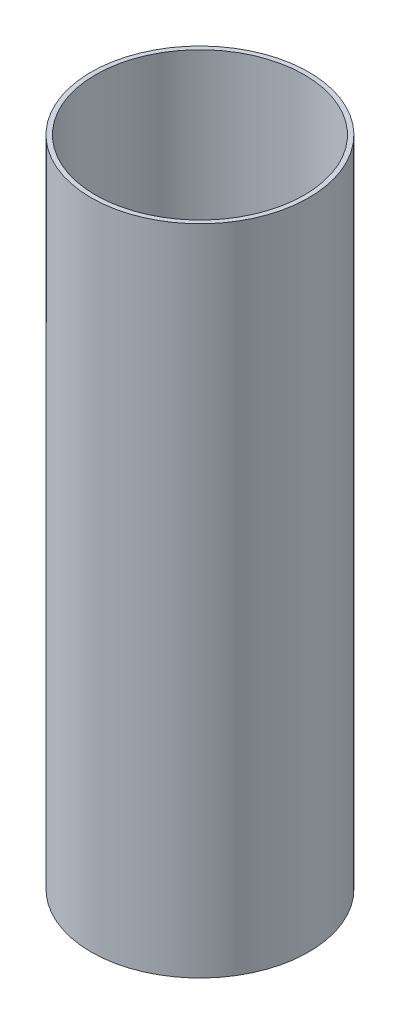
ISO-10303-21;
HEADER;
FILE_DESCRIPTION(('STEP AP214'),'2;1');
FILE_NAME('part.step','',(''),(''),'','','');
FILE_SCHEMA(('AUTOMOTIVE_DESIGN { 1 0 10303 214 1 1 1 1 }'));
ENDSEC;
DATA;
#1=APPLICATION_CONTEXT('core data for automotive mechanical design processes');
#2=APPLICATION_PROTOCOL_DEFINITION('international standard','automotive_design',2000,#1);
#3=PRODUCT_CONTEXT('',#1,'mechanical');
#4=PRODUCT('Part','Part','',(#3));
#5=PRODUCT_RELATED_PRODUCT_CATEGORY('part','',(#4));
#6=PRODUCT_DEFINITION_FORMATION('','',#4);
#7=PRODUCT_DEFINITION_CONTEXT('part definition',#1,'design');
#8=PRODUCT_DEFINITION('design','',#6,#7);
#9=PRODUCT_DEFINITION_SHAPE('','',#8);
#10=(LENGTH_UNIT() NAMED_UNIT(*) SI_UNIT(.MILLI.,.METRE.));
#11=(NAMED_UNIT(*) PLANE_ANGLE_UNIT() SI_UNIT($,.RADIAN.));
#12=(NAMED_UNIT(*) SI_UNIT($,.STERADIAN.) SOLID_ANGLE_UNIT());
#13=UNCERTAINTY_MEASURE_WITH_UNIT(LENGTH_MEASURE(1.E-05),#10,'distance_accuracy_value','');
#14=(GEOMETRIC_REPRESENTATION_CONTEXT(3) GLOBAL_UNCERTAINTY_ASSIGNED_CONTEXT((#13)) GLOBAL_UNIT_ASSIGNED_CONTEXT((#10,
#11,#12)) REPRESENTATION_CONTEXT('',''));
#15=CARTESIAN_POINT('',(0.,0.,0.));
#16=DIRECTION('',(0.,0.,1.));
#17=DIRECTION('',(1.,0.,0.));
#18=AXIS2_PLACEMENT_3D('',#15,#16,#17);
#19=CARTESIAN_POINT('',(0.,457.2,0.));
#20=DIRECTION('',(0.,1.,0.));
#21=DIRECTION('',(0.,0.,1.));
#22=AXIS2_PLACEMENT_3D('',#19,#20,#21);
#23=PLANE('',#22);
#24=CARTESIAN_POINT('',(0.,457.2,0.));
#25=DIRECTION('',(0.,1.,0.));
#26=DIRECTION('',(0.,0.,1.));
#27=AXIS2_PLACEMENT_3D('',#24,#25,#26);
#28=CIRCLE('',#27,76.2);
#29=CARTESIAN_POINT('',(0.,457.2,76.2));
#30=VERTEX_POINT('',#29);
#31=EDGE_CURVE('E11',#30,#30,#28,.T.);
#32=ORIENTED_EDGE('',*,*,#31,.T.);
#33=EDGE_LOOP('',(#32));
#34=FACE_BOUND('',#33,.T.);
#35=CARTESIAN_POINT('',(0.,457.2,0.));
#36=DIRECTION('',(0.,1.,0.));
#37=DIRECTION('',(0.,0.,1.));
#38=AXIS2_PLACEMENT_3D('',#35,#36,#37);
#39=CIRCLE('',#38,73.025);
#40=CARTESIAN_POINT('',(0.,457.2,73.025));
#41=VERTEX_POINT('',#40);
#42=EDGE_CURVE('E56',#41,#41,#39,.T.);
#43=ORIENTED_EDGE('',*,*,#42,.F.);
#44=EDGE_LOOP('',(#43));
#45=FACE_BOUND('',#44,.T.);
#46=ADVANCED_FACE('F43',(#34,#45),#23,.T.);
#47=CARTESIAN_POINT('',(0.,0.,0.));
#48=DIRECTION('',(0.,1.,0.));
#49=DIRECTION('',(0.,0.,1.));
#50=AXIS2_PLACEMENT_3D('',#47,#48,#49);
#51=PLANE('',#50);
#52=CARTESIAN_POINT('',(0.,0.,0.));
#53=DIRECTION('',(0.,1.,0.));
#54=DIRECTION('',(0.,0.,1.));
#55=AXIS2_PLACEMENT_3D('',#52,#53,#54);
#56=CIRCLE('',#55,76.2);
#57=CARTESIAN_POINT('',(0.,0.,76.2));
#58=VERTEX_POINT('',#57);
#59=EDGE_CURVE('E47',#58,#58,#56,.T.);
#60=ORIENTED_EDGE('',*,*,#59,.F.);
#61=EDGE_LOOP('',(#60));
#62=FACE_BOUND('',#61,.T.);
#63=CARTESIAN_POINT('',(0.,0.,0.));
#64=DIRECTION('',(0.,1.,0.));
#65=DIRECTION('',(0.,0.,1.));
#66=AXIS2_PLACEMENT_3D('',#63,#64,#65);
#67=CIRCLE('',#66,73.025);
#68=CARTESIAN_POINT('',(0.,0.,73.025));
#69=VERTEX_POINT('',#68);
#70=EDGE_CURVE('E58',#69,#69,#67,.T.);
#71=ORIENTED_EDGE('',*,*,#70,.T.);
#72=EDGE_LOOP('',(#71));
#73=FACE_BOUND('',#72,.T.);
#74=ADVANCED_FACE('F70',(#62,#73),#51,.F.);
#75=CARTESIAN_POINT('',(0.,457.2,0.));
#76=DIRECTION('',(0.,-1.,0.));
#77=DIRECTION('',(0.,0.,-1.));
#78=AXIS2_PLACEMENT_3D('',#75,#76,#77);
#79=CYLINDRICAL_SURFACE('',#78,76.2);
#80=ORIENTED_EDGE('',*,*,#31,.F.);
#81=EDGE_LOOP('',(#80));
#82=FACE_BOUND('',#81,.T.);
#83=ORIENTED_EDGE('',*,*,#59,.T.);
#84=EDGE_LOOP('',(#83));
#85=FACE_BOUND('',#84,.T.);
#86=ADVANCED_FACE('F45',(#82,#85),#79,.T.);
#87=CARTESIAN_POINT('',(0.,457.2,0.));
#88=DIRECTION('',(0.,-1.,0.));
#89=DIRECTION('',(0.,0.,-1.));
#90=AXIS2_PLACEMENT_3D('',#87,#88,#89);
#91=CYLINDRICAL_SURFACE('',#90,73.025);
#92=ORIENTED_EDGE('',*,*,#42,.T.);
#93=EDGE_LOOP('',(#92));
#94=FACE_BOUND('',#93,.T.);
#95=ORIENTED_EDGE('',*,*,#70,.F.);
#96=EDGE_LOOP('',(#95));
#97=FACE_BOUND('',#96,.T.);
#98=ADVANCED_FACE('F66',(#94,#97),#91,.F.);
#99=CLOSED_SHELL('',(#46,#74,#86,#98));
#100=MANIFOLD_SOLID_BREP('B2',#99);
#101=ADVANCED_BREP_SHAPE_REPRESENTATION('',(#18,#100),#14);
#102=SHAPE_DEFINITION_REPRESENTATION(#9,#101);
ENDSEC;
END-ISO-10303-21;
